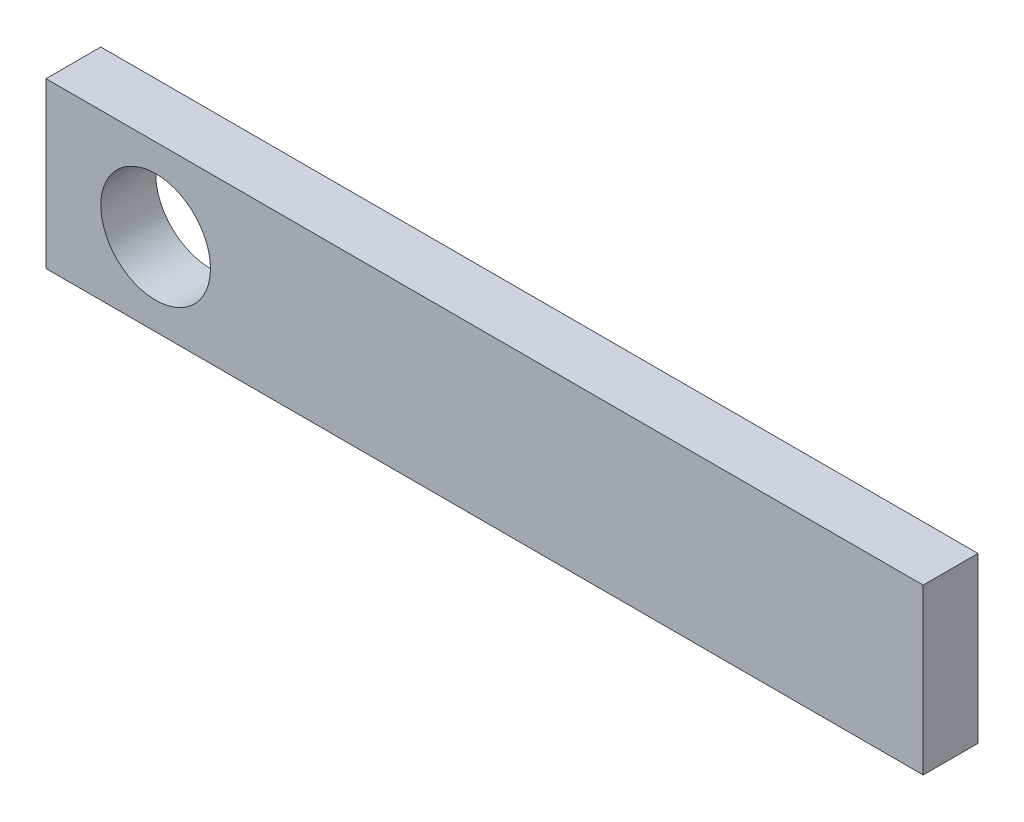
ISO-10303-21;
HEADER;
FILE_DESCRIPTION(('STEP AP214'),'2;1');
FILE_NAME('part.step','',(''),(''),'','','');
FILE_SCHEMA(('AUTOMOTIVE_DESIGN { 1 0 10303 214 1 1 1 1 }'));
ENDSEC;
DATA;
#1=APPLICATION_CONTEXT('core data for automotive mechanical design processes');
#2=APPLICATION_PROTOCOL_DEFINITION('international standard','automotive_design',2000,#1);
#3=PRODUCT_CONTEXT('',#1,'mechanical');
#4=PRODUCT('Part','Part','',(#3));
#5=PRODUCT_RELATED_PRODUCT_CATEGORY('part','',(#4));
#6=PRODUCT_DEFINITION_FORMATION('','',#4);
#7=PRODUCT_DEFINITION_CONTEXT('part definition',#1,'design');
#8=PRODUCT_DEFINITION('design','',#6,#7);
#9=PRODUCT_DEFINITION_SHAPE('','',#8);
#10=(LENGTH_UNIT() NAMED_UNIT(*) SI_UNIT(.MILLI.,.METRE.));
#11=(NAMED_UNIT(*) PLANE_ANGLE_UNIT() SI_UNIT($,.RADIAN.));
#12=(NAMED_UNIT(*) SI_UNIT($,.STERADIAN.) SOLID_ANGLE_UNIT());
#13=UNCERTAINTY_MEASURE_WITH_UNIT(LENGTH_MEASURE(1.E-05),#10,'distance_accuracy_value','');
#14=(GEOMETRIC_REPRESENTATION_CONTEXT(3) GLOBAL_UNCERTAINTY_ASSIGNED_CONTEXT((#13)) GLOBAL_UNIT_ASSIGNED_CONTEXT((#10,
#11,#12)) REPRESENTATION_CONTEXT('',''));
#15=CARTESIAN_POINT('',(0.,0.,0.));
#16=DIRECTION('',(0.,0.,1.));
#17=DIRECTION('',(1.,0.,0.));
#18=AXIS2_PLACEMENT_3D('',#15,#16,#17);
#19=CARTESIAN_POINT('',(0.,0.,10.));
#20=DIRECTION('',(0.,0.,-1.));
#21=DIRECTION('',(-1.,0.,0.));
#22=AXIS2_PLACEMENT_3D('',#19,#20,#21);
#23=PLANE('',#22);
#24=DIRECTION('',(0.,-1.,0.));
#25=VECTOR('',#24,1.);
#26=CARTESIAN_POINT('',(-20.,-15.,10.));
#27=LINE('',#26,#25);
#28=CARTESIAN_POINT('',(-20.,15.,10.));
#29=VERTEX_POINT('',#28);
#30=CARTESIAN_POINT('',(-20.,-15.,10.));
#31=VERTEX_POINT('',#30);
#32=EDGE_CURVE('E94',#29,#31,#27,.T.);
#33=ORIENTED_EDGE('',*,*,#32,.T.);
#34=DIRECTION('',(1.,0.,0.));
#35=VECTOR('',#34,1.);
#36=CARTESIAN_POINT('',(-20.,-15.,10.));
#37=LINE('',#36,#35);
#38=CARTESIAN_POINT('',(140.,-15.,10.));
#39=VERTEX_POINT('',#38);
#40=EDGE_CURVE('E86',#31,#39,#37,.T.);
#41=ORIENTED_EDGE('',*,*,#40,.T.);
#42=DIRECTION('',(0.,1.,0.));
#43=VECTOR('',#42,1.);
#44=CARTESIAN_POINT('',(140.,-15.,10.));
#45=LINE('',#44,#43);
#46=CARTESIAN_POINT('',(140.,15.,10.));
#47=VERTEX_POINT('',#46);
#48=EDGE_CURVE('E91',#39,#47,#45,.T.);
#49=ORIENTED_EDGE('',*,*,#48,.T.);
#50=DIRECTION('',(-1.,0.,0.));
#51=VECTOR('',#50,1.);
#52=CARTESIAN_POINT('',(-20.,15.,10.));
#53=LINE('',#52,#51);
#54=EDGE_CURVE('E59',#47,#29,#53,.T.);
#55=ORIENTED_EDGE('',*,*,#54,.T.);
#56=EDGE_LOOP('',(#33,#41,#49,#55));
#57=FACE_BOUND('',#56,.T.);
#58=CARTESIAN_POINT('',(0.,0.,10.));
#59=DIRECTION('',(0.,0.,1.));
#60=DIRECTION('',(1.,0.,0.));
#61=AXIS2_PLACEMENT_3D('',#58,#59,#60);
#62=CIRCLE('',#61,10.);
#63=CARTESIAN_POINT('',(10.,0.,10.));
#64=VERTEX_POINT('',#63);
#65=EDGE_CURVE('E108',#64,#64,#62,.T.);
#66=ORIENTED_EDGE('',*,*,#65,.F.);
#67=EDGE_LOOP('',(#66));
#68=FACE_BOUND('',#67,.T.);
#69=ADVANCED_FACE('F41',(#57,#68),#23,.F.);
#70=CARTESIAN_POINT('',(0.,0.,0.));
#71=DIRECTION('',(0.,0.,-1.));
#72=DIRECTION('',(-1.,0.,0.));
#73=AXIS2_PLACEMENT_3D('',#70,#71,#72);
#74=PLANE('',#73);
#75=DIRECTION('',(0.,-1.,0.));
#76=VECTOR('',#75,1.);
#77=CARTESIAN_POINT('',(-20.,-15.,0.));
#78=LINE('',#77,#76);
#79=CARTESIAN_POINT('',(-20.,15.,0.));
#80=VERTEX_POINT('',#79);
#81=CARTESIAN_POINT('',(-20.,-15.,0.));
#82=VERTEX_POINT('',#81);
#83=EDGE_CURVE('E102',#80,#82,#78,.T.);
#84=ORIENTED_EDGE('',*,*,#83,.F.);
#85=DIRECTION('',(-1.,0.,0.));
#86=VECTOR('',#85,1.);
#87=CARTESIAN_POINT('',(-20.,15.,0.));
#88=LINE('',#87,#86);
#89=CARTESIAN_POINT('',(140.,15.,0.));
#90=VERTEX_POINT('',#89);
#91=EDGE_CURVE('E82',#90,#80,#88,.T.);
#92=ORIENTED_EDGE('',*,*,#91,.F.);
#93=DIRECTION('',(0.,1.,0.));
#94=VECTOR('',#93,1.);
#95=CARTESIAN_POINT('',(140.,-15.,0.));
#96=LINE('',#95,#94);
#97=CARTESIAN_POINT('',(140.,-15.,0.));
#98=VERTEX_POINT('',#97);
#99=EDGE_CURVE('E75',#98,#90,#96,.T.);
#100=ORIENTED_EDGE('',*,*,#99,.F.);
#101=DIRECTION('',(1.,0.,0.));
#102=VECTOR('',#101,1.);
#103=CARTESIAN_POINT('',(-20.,-15.,0.));
#104=LINE('',#103,#102);
#105=EDGE_CURVE('E97',#82,#98,#104,.T.);
#106=ORIENTED_EDGE('',*,*,#105,.F.);
#107=EDGE_LOOP('',(#84,#92,#100,#106));
#108=FACE_BOUND('',#107,.T.);
#109=CARTESIAN_POINT('',(0.,0.,0.));
#110=DIRECTION('',(0.,0.,1.));
#111=DIRECTION('',(1.,0.,0.));
#112=AXIS2_PLACEMENT_3D('',#109,#110,#111);
#113=CIRCLE('',#112,10.);
#114=CARTESIAN_POINT('',(10.,0.,0.));
#115=VERTEX_POINT('',#114);
#116=EDGE_CURVE('E119',#115,#115,#113,.T.);
#117=ORIENTED_EDGE('',*,*,#116,.T.);
#118=EDGE_LOOP('',(#117));
#119=FACE_BOUND('',#118,.T.);
#120=ADVANCED_FACE('F116',(#108,#119),#74,.T.);
#121=CARTESIAN_POINT('',(-20.,-15.,10.));
#122=DIRECTION('',(1.,0.,0.));
#123=DIRECTION('',(0.,0.,-1.));
#124=AXIS2_PLACEMENT_3D('',#121,#122,#123);
#125=PLANE('',#124);
#126=ORIENTED_EDGE('',*,*,#83,.T.);
#127=DIRECTION('',(0.,0.,-1.));
#128=VECTOR('',#127,1.);
#129=CARTESIAN_POINT('',(-20.,-15.,10.));
#130=LINE('',#129,#128);
#131=EDGE_CURVE('E11',#31,#82,#130,.T.);
#132=ORIENTED_EDGE('',*,*,#131,.F.);
#133=ORIENTED_EDGE('',*,*,#32,.F.);
#134=DIRECTION('',(0.,0.,-1.));
#135=VECTOR('',#134,1.);
#136=CARTESIAN_POINT('',(-20.,15.,10.));
#137=LINE('',#136,#135);
#138=EDGE_CURVE('E103',#29,#80,#137,.T.);
#139=ORIENTED_EDGE('',*,*,#138,.T.);
#140=EDGE_LOOP('',(#126,#132,#133,#139));
#141=FACE_BOUND('',#140,.T.);
#142=ADVANCED_FACE('F43',(#141),#125,.F.);
#143=CARTESIAN_POINT('',(-20.,-15.,10.));
#144=DIRECTION('',(0.,1.,0.));
#145=DIRECTION('',(0.,0.,1.));
#146=AXIS2_PLACEMENT_3D('',#143,#144,#145);
#147=PLANE('',#146);
#148=ORIENTED_EDGE('',*,*,#105,.T.);
#149=DIRECTION('',(0.,0.,-1.));
#150=VECTOR('',#149,1.);
#151=CARTESIAN_POINT('',(140.,-15.,10.));
#152=LINE('',#151,#150);
#153=EDGE_CURVE('E49',#39,#98,#152,.T.);
#154=ORIENTED_EDGE('',*,*,#153,.F.);
#155=ORIENTED_EDGE('',*,*,#40,.F.);
#156=ORIENTED_EDGE('',*,*,#131,.T.);
#157=EDGE_LOOP('',(#148,#154,#155,#156));
#158=FACE_BOUND('',#157,.T.);
#159=ADVANCED_FACE('F98',(#158),#147,.F.);
#160=CARTESIAN_POINT('',(140.,-15.,10.));
#161=DIRECTION('',(-1.,0.,0.));
#162=DIRECTION('',(0.,0.,1.));
#163=AXIS2_PLACEMENT_3D('',#160,#161,#162);
#164=PLANE('',#163);
#165=ORIENTED_EDGE('',*,*,#99,.T.);
#166=DIRECTION('',(0.,0.,-1.));
#167=VECTOR('',#166,1.);
#168=CARTESIAN_POINT('',(140.,15.,10.));
#169=LINE('',#168,#167);
#170=EDGE_CURVE('E96',#47,#90,#169,.T.);
#171=ORIENTED_EDGE('',*,*,#170,.F.);
#172=ORIENTED_EDGE('',*,*,#48,.F.);
#173=ORIENTED_EDGE('',*,*,#153,.T.);
#174=EDGE_LOOP('',(#165,#171,#172,#173));
#175=FACE_BOUND('',#174,.T.);
#176=ADVANCED_FACE('F100',(#175),#164,.F.);
#177=CARTESIAN_POINT('',(-20.,15.,10.));
#178=DIRECTION('',(0.,-1.,0.));
#179=DIRECTION('',(0.,0.,-1.));
#180=AXIS2_PLACEMENT_3D('',#177,#178,#179);
#181=PLANE('',#180);
#182=ORIENTED_EDGE('',*,*,#91,.T.);
#183=ORIENTED_EDGE('',*,*,#138,.F.);
#184=ORIENTED_EDGE('',*,*,#54,.F.);
#185=ORIENTED_EDGE('',*,*,#170,.T.);
#186=EDGE_LOOP('',(#182,#183,#184,#185));
#187=FACE_BOUND('',#186,.T.);
#188=ADVANCED_FACE('F113',(#187),#181,.F.);
#189=CARTESIAN_POINT('',(0.,0.,10.));
#190=DIRECTION('',(0.,0.,-1.));
#191=DIRECTION('',(-1.,0.,0.));
#192=AXIS2_PLACEMENT_3D('',#189,#190,#191);
#193=CYLINDRICAL_SURFACE('',#192,10.);
#194=ORIENTED_EDGE('',*,*,#65,.T.);
#195=EDGE_LOOP('',(#194));
#196=FACE_BOUND('',#195,.T.);
#197=ORIENTED_EDGE('',*,*,#116,.F.);
#198=EDGE_LOOP('',(#197));
#199=FACE_BOUND('',#198,.T.);
#200=ADVANCED_FACE('F127',(#196,#199),#193,.F.);
#201=CLOSED_SHELL('',(#69,#120,#142,#159,#176,#188,#200));
#202=MANIFOLD_SOLID_BREP('B2',#201);
#203=ADVANCED_BREP_SHAPE_REPRESENTATION('',(#18,#202),#14);
#204=SHAPE_DEFINITION_REPRESENTATION(#9,#203);
ENDSEC;
END-ISO-10303-21;
